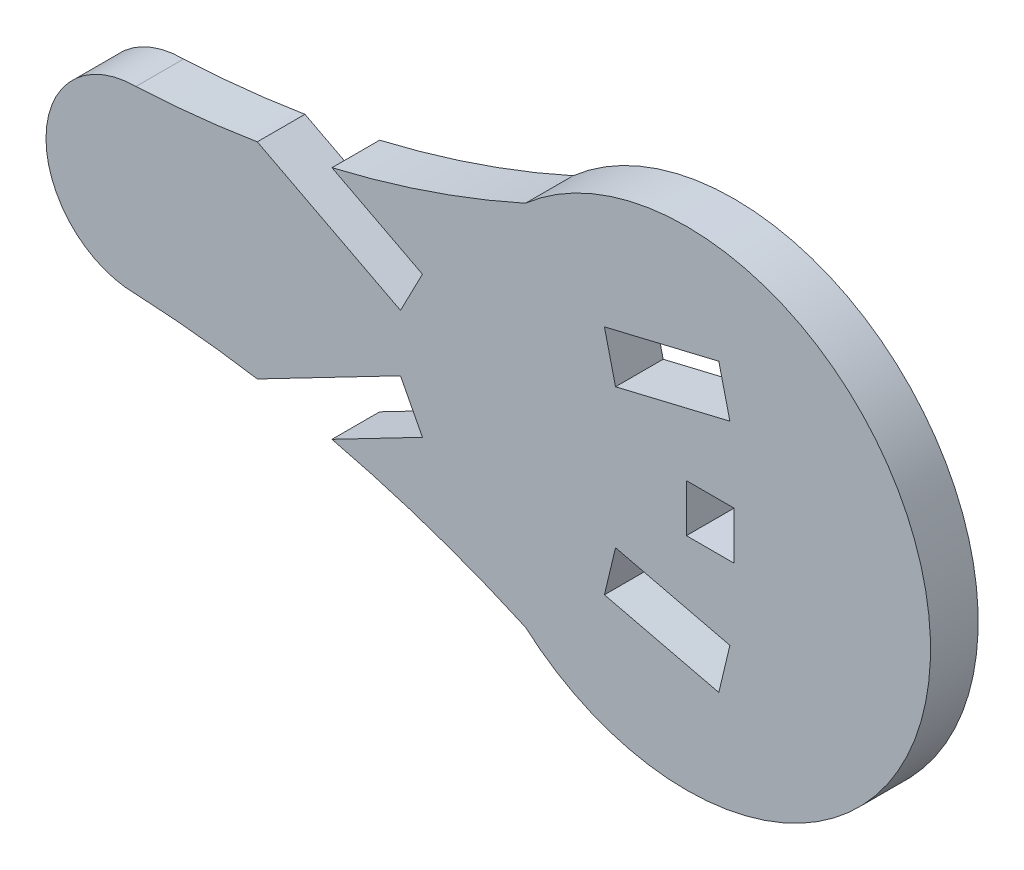
ISO-10303-21;
HEADER;
FILE_DESCRIPTION(('STEP AP214'),'2;1');
FILE_NAME('part.step','',(''),(''),'','','');
FILE_SCHEMA(('AUTOMOTIVE_DESIGN { 1 0 10303 214 1 1 1 1 }'));
ENDSEC;
DATA;
#1=APPLICATION_CONTEXT('core data for automotive mechanical design processes');
#2=APPLICATION_PROTOCOL_DEFINITION('international standard','automotive_design',2000,#1);
#3=PRODUCT_CONTEXT('',#1,'mechanical');
#4=PRODUCT('Part','Part','',(#3));
#5=PRODUCT_RELATED_PRODUCT_CATEGORY('part','',(#4));
#6=PRODUCT_DEFINITION_FORMATION('','',#4);
#7=PRODUCT_DEFINITION_CONTEXT('part definition',#1,'design');
#8=PRODUCT_DEFINITION('design','',#6,#7);
#9=PRODUCT_DEFINITION_SHAPE('','',#8);
#10=(LENGTH_UNIT() NAMED_UNIT(*) SI_UNIT(.MILLI.,.METRE.));
#11=(NAMED_UNIT(*) PLANE_ANGLE_UNIT() SI_UNIT($,.RADIAN.));
#12=(NAMED_UNIT(*) SI_UNIT($,.STERADIAN.) SOLID_ANGLE_UNIT());
#13=UNCERTAINTY_MEASURE_WITH_UNIT(LENGTH_MEASURE(1.E-05),#10,'distance_accuracy_value','');
#14=(GEOMETRIC_REPRESENTATION_CONTEXT(3) GLOBAL_UNCERTAINTY_ASSIGNED_CONTEXT((#13)) GLOBAL_UNIT_ASSIGNED_CONTEXT((#10,
#11,#12)) REPRESENTATION_CONTEXT('',''));
#15=CARTESIAN_POINT('',(0.,0.,0.));
#16=DIRECTION('',(0.,0.,1.));
#17=DIRECTION('',(1.,0.,0.));
#18=AXIS2_PLACEMENT_3D('',#15,#16,#17);
#19=CARTESIAN_POINT('',(-19.2380535907943,-37.8424047856186,-1.524));
#20=DIRECTION('',(0.,0.,1.));
#21=DIRECTION('',(1.,0.,0.));
#22=AXIS2_PLACEMENT_3D('',#19,#20,#21);
#23=CYLINDRICAL_SURFACE('',#22,34.2445785171118);
#24=DIRECTION('',(0.,0.,1.));
#25=VECTOR('',#24,1.);
#26=CARTESIAN_POINT('',(-11.3324745395271,-4.52284629996638,-1.524));
#27=LINE('',#26,#25);
#28=CARTESIAN_POINT('',(-11.3324745395271,-4.52284629996638,-1.524));
#29=VERTEX_POINT('',#28);
#30=CARTESIAN_POINT('',(-11.3324745395271,-4.52284629996638,0.));
#31=VERTEX_POINT('',#30);
#32=EDGE_CURVE('E279',#29,#31,#27,.T.);
#33=ORIENTED_EDGE('',*,*,#32,.F.);
#34=CARTESIAN_POINT('',(-19.2380535907943,-37.8424047856186,-1.524));
#35=DIRECTION('',(0.,0.,-1.));
#36=DIRECTION('',(-1.,0.,0.));
#37=AXIS2_PLACEMENT_3D('',#34,#35,#36);
#38=CIRCLE('',#37,34.2445785171118);
#39=CARTESIAN_POINT('',(-5.14499179069349,-6.63220185591671,-1.524));
#40=VERTEX_POINT('',#39);
#41=EDGE_CURVE('E342',#29,#40,#38,.T.);
#42=ORIENTED_EDGE('',*,*,#41,.T.);
#43=DIRECTION('',(0.,0.,1.));
#44=VECTOR('',#43,1.);
#45=CARTESIAN_POINT('',(-5.14499179069349,-6.63220185591671,-1.524));
#46=LINE('',#45,#44);
#47=CARTESIAN_POINT('',(-5.14499179069349,-6.63220185591671,0.));
#48=VERTEX_POINT('',#47);
#49=EDGE_CURVE('E372',#40,#48,#46,.T.);
#50=ORIENTED_EDGE('',*,*,#49,.T.);
#51=CARTESIAN_POINT('',(-19.2380535907943,-37.8424047856186,0.));
#52=DIRECTION('',(0.,0.,-1.));
#53=DIRECTION('',(-1.,0.,0.));
#54=AXIS2_PLACEMENT_3D('',#51,#52,#53);
#55=CIRCLE('',#54,34.2445785171118);
#56=EDGE_CURVE('E357',#31,#48,#55,.T.);
#57=ORIENTED_EDGE('',*,*,#56,.F.);
#58=EDGE_LOOP('',(#33,#42,#50,#57));
#59=FACE_BOUND('',#58,.T.);
#60=ADVANCED_FACE('F32',(#59),#23,.F.);
#61=CARTESIAN_POINT('',(-19.2380535907943,36.3184047856186,-1.524));
#62=DIRECTION('',(0.,0.,1.));
#63=DIRECTION('',(1.,0.,0.));
#64=AXIS2_PLACEMENT_3D('',#61,#62,#63);
#65=CYLINDRICAL_SURFACE('',#64,34.2445785171118);
#66=DIRECTION('',(0.,0.,1.));
#67=VECTOR('',#66,1.);
#68=CARTESIAN_POINT('',(-13.7196291128845,2.52139087763793,-1.524));
#69=LINE('',#68,#67);
#70=CARTESIAN_POINT('',(-13.7196291128845,2.52139087763792,-1.524));
#71=VERTEX_POINT('',#70);
#72=CARTESIAN_POINT('',(-13.7196291128845,2.52139087763792,0.));
#73=VERTEX_POINT('',#72);
#74=EDGE_CURVE('E304',#71,#73,#69,.T.);
#75=ORIENTED_EDGE('',*,*,#74,.F.);
#76=CARTESIAN_POINT('',(-19.2380535907943,36.3184047856186,-1.524));
#77=DIRECTION('',(0.,0.,-1.));
#78=DIRECTION('',(1.,0.,0.));
#79=AXIS2_PLACEMENT_3D('',#76,#77,#78);
#80=CIRCLE('',#79,34.2445785171118);
#81=CARTESIAN_POINT('',(-17.59996749399,2.11302755112387,-1.524));
#82=VERTEX_POINT('',#81);
#83=EDGE_CURVE('E350',#71,#82,#80,.T.);
#84=ORIENTED_EDGE('',*,*,#83,.T.);
#85=DIRECTION('',(0.,0.,1.));
#86=VECTOR('',#85,1.);
#87=CARTESIAN_POINT('',(-17.59996749399,2.11302755112387,-1.524));
#88=LINE('',#87,#86);
#89=CARTESIAN_POINT('',(-17.59996749399,2.11302755112387,0.));
#90=VERTEX_POINT('',#89);
#91=EDGE_CURVE('E367',#82,#90,#88,.T.);
#92=ORIENTED_EDGE('',*,*,#91,.T.);
#93=CARTESIAN_POINT('',(-19.2380535907943,36.3184047856186,0.));
#94=DIRECTION('',(0.,0.,-1.));
#95=DIRECTION('',(1.,0.,0.));
#96=AXIS2_PLACEMENT_3D('',#93,#94,#95);
#97=CIRCLE('',#96,34.2445785171118);
#98=EDGE_CURVE('E364',#73,#90,#97,.T.);
#99=ORIENTED_EDGE('',*,*,#98,.F.);
#100=EDGE_LOOP('',(#75,#84,#92,#99));
#101=FACE_BOUND('',#100,.T.);
#102=ADVANCED_FACE('F398',(#101),#65,.F.);
#103=CARTESIAN_POINT('',(-17.59996749399,-0.762000000000001,-1.524));
#104=DIRECTION('',(0.,0.,1.));
#105=DIRECTION('',(1.,0.,0.));
#106=AXIS2_PLACEMENT_3D('',#103,#104,#105);
#107=CYLINDRICAL_SURFACE('',#106,2.87502755112387);
#108=CARTESIAN_POINT('',(-17.59996749399,-0.762000000000001,0.));
#109=DIRECTION('',(0.,0.,1.));
#110=DIRECTION('',(1.,0.,0.));
#111=AXIS2_PLACEMENT_3D('',#108,#109,#110);
#112=CIRCLE('',#111,2.87502755112387);
#113=CARTESIAN_POINT('',(-17.59996749399,-3.63702755112387,0.));
#114=VERTEX_POINT('',#113);
#115=EDGE_CURVE('E332',#90,#114,#112,.T.);
#116=ORIENTED_EDGE('',*,*,#115,.F.);
#117=ORIENTED_EDGE('',*,*,#91,.F.);
#118=CARTESIAN_POINT('',(-17.59996749399,-0.762000000000001,-1.524));
#119=DIRECTION('',(0.,0.,1.));
#120=DIRECTION('',(1.,0.,0.));
#121=AXIS2_PLACEMENT_3D('',#118,#119,#120);
#122=CIRCLE('',#121,2.87502755112387);
#123=CARTESIAN_POINT('',(-17.59996749399,-3.63702755112387,-1.524));
#124=VERTEX_POINT('',#123);
#125=EDGE_CURVE('E339',#82,#124,#122,.T.);
#126=ORIENTED_EDGE('',*,*,#125,.T.);
#127=DIRECTION('',(0.,0.,1.));
#128=VECTOR('',#127,1.);
#129=CARTESIAN_POINT('',(-17.59996749399,-3.63702755112387,-1.524));
#130=LINE('',#129,#128);
#131=EDGE_CURVE('E354',#124,#114,#130,.T.);
#132=ORIENTED_EDGE('',*,*,#131,.T.);
#133=EDGE_LOOP('',(#116,#117,#126,#132));
#134=FACE_BOUND('',#133,.T.);
#135=ADVANCED_FACE('F34',(#134),#107,.T.);
#136=DIRECTION('',(0.,0.,1.));
#137=VECTOR('',#136,1.);
#138=CARTESIAN_POINT('',(-11.3324745395271,2.99884629996638,-1.524));
#139=LINE('',#138,#137);
#140=CARTESIAN_POINT('',(-11.3324745395271,2.99884629996638,0.));
#141=VERTEX_POINT('',#140);
#142=CARTESIAN_POINT('',(-11.3324745395271,2.99884629996638,-1.524));
#143=VERTEX_POINT('',#142);
#144=EDGE_CURVE('E299',#141,#143,#139,.F.);
#145=ORIENTED_EDGE('',*,*,#144,.F.);
#146=CARTESIAN_POINT('',(-5.14499179069349,5.10820185591671,0.));
#147=VERTEX_POINT('',#146);
#148=EDGE_CURVE('E343',#147,#141,#97,.T.);
#149=ORIENTED_EDGE('',*,*,#148,.F.);
#150=DIRECTION('',(0.,0.,1.));
#151=VECTOR('',#150,1.);
#152=CARTESIAN_POINT('',(-5.14499179069349,5.10820185591671,-1.524));
#153=LINE('',#152,#151);
#154=CARTESIAN_POINT('',(-5.14499179069349,5.10820185591671,-1.524));
#155=VERTEX_POINT('',#154);
#156=EDGE_CURVE('E370',#155,#147,#153,.T.);
#157=ORIENTED_EDGE('',*,*,#156,.F.);
#158=EDGE_CURVE('E351',#155,#143,#80,.T.);
#159=ORIENTED_EDGE('',*,*,#158,.T.);
#160=EDGE_LOOP('',(#145,#149,#157,#159));
#161=FACE_BOUND('',#160,.T.);
#162=ADVANCED_FACE('F428',(#161),#65,.F.);
#163=CARTESIAN_POINT('',(0.,-0.762000000000001,-1.524));
#164=DIRECTION('',(0.,0.,1.));
#165=DIRECTION('',(1.,0.,0.));
#166=AXIS2_PLACEMENT_3D('',#163,#164,#165);
#167=CYLINDRICAL_SURFACE('',#166,7.80578057310807);
#168=CARTESIAN_POINT('',(0.,-0.762000000000001,0.));
#169=DIRECTION('',(0.,0.,1.));
#170=DIRECTION('',(1.,0.,0.));
#171=AXIS2_PLACEMENT_3D('',#168,#169,#170);
#172=CIRCLE('',#171,7.80578057310807);
#173=EDGE_CURVE('E361',#48,#147,#172,.T.);
#174=ORIENTED_EDGE('',*,*,#173,.F.);
#175=ORIENTED_EDGE('',*,*,#49,.F.);
#176=CARTESIAN_POINT('',(0.,-0.762000000000001,-1.524));
#177=DIRECTION('',(0.,0.,1.));
#178=DIRECTION('',(1.,0.,0.));
#179=AXIS2_PLACEMENT_3D('',#176,#177,#178);
#180=CIRCLE('',#179,7.80578057310807);
#181=EDGE_CURVE('E347',#40,#155,#180,.T.);
#182=ORIENTED_EDGE('',*,*,#181,.T.);
#183=ORIENTED_EDGE('',*,*,#156,.T.);
#184=EDGE_LOOP('',(#174,#175,#182,#183));
#185=FACE_BOUND('',#184,.T.);
#186=ADVANCED_FACE('F424',(#185),#167,.T.);
#187=DIRECTION('',(0.,0.,1.));
#188=VECTOR('',#187,1.);
#189=CARTESIAN_POINT('',(-13.7196291128845,-4.04539087763792,-1.524));
#190=LINE('',#189,#188);
#191=CARTESIAN_POINT('',(-13.7196291128845,-4.04539087763791,0.));
#192=VERTEX_POINT('',#191);
#193=CARTESIAN_POINT('',(-13.7196291128845,-4.04539087763792,-1.524));
#194=VERTEX_POINT('',#193);
#195=EDGE_CURVE('E274',#192,#194,#190,.F.);
#196=ORIENTED_EDGE('',*,*,#195,.F.);
#197=EDGE_CURVE('E358',#114,#192,#55,.T.);
#198=ORIENTED_EDGE('',*,*,#197,.F.);
#199=ORIENTED_EDGE('',*,*,#131,.F.);
#200=EDGE_CURVE('E344',#124,#194,#38,.T.);
#201=ORIENTED_EDGE('',*,*,#200,.T.);
#202=EDGE_LOOP('',(#196,#198,#199,#201));
#203=FACE_BOUND('',#202,.T.);
#204=ADVANCED_FACE('F407',(#203),#23,.F.);
#205=CARTESIAN_POINT('',(-18.4190105423922,-19.3022023928093,-1.524));
#206=DIRECTION('',(0.,0.,1.));
#207=DIRECTION('',(1.,0.,0.));
#208=AXIS2_PLACEMENT_3D('',#205,#206,#207);
#209=PLANE('',#208);
#210=DIRECTION('',(-0.972538002608105,0.232744137376298,0.));
#211=VECTOR('',#210,1.);
#212=CARTESIAN_POINT('',(-13.8517188087433,-0.217447648633504,-1.524));
#213=LINE('',#212,#211);
#214=CARTESIAN_POINT('',(1.39062325581189,-3.86518762989456,-1.524));
#215=VERTEX_POINT('',#214);
#216=CARTESIAN_POINT('',(-2.26611337656362,-2.99007117086453,-1.524));
#217=VERTEX_POINT('',#216);
#218=EDGE_CURVE('E224',#215,#217,#213,.T.);
#219=ORIENTED_EDGE('',*,*,#218,.T.);
#220=DIRECTION('',(-0.232744137376298,-0.972538002608105,0.));
#221=VECTOR('',#220,1.);
#222=CARTESIAN_POINT('',(-6.83340511021252,-22.0748259150403,-1.524));
#223=LINE('',#222,#221);
#224=CARTESIAN_POINT('',(-2.6208154419251,-4.47221908683928,-1.524));
#225=VERTEX_POINT('',#224);
#226=EDGE_CURVE('E227',#217,#225,#223,.T.);
#227=ORIENTED_EDGE('',*,*,#226,.T.);
#228=DIRECTION('',(0.972538002608105,-0.232744137376298,0.));
#229=VECTOR('',#228,1.);
#230=CARTESIAN_POINT('',(-14.2064208741047,-1.69959556460825,-1.524));
#231=LINE('',#230,#229);
#232=CARTESIAN_POINT('',(1.03592119045041,-5.34733554586931,-1.524));
#233=VERTEX_POINT('',#232);
#234=EDGE_CURVE('E219',#225,#233,#231,.T.);
#235=ORIENTED_EDGE('',*,*,#234,.T.);
#236=DIRECTION('',(0.232744137376299,0.972538002608105,0.));
#237=VECTOR('',#236,1.);
#238=CARTESIAN_POINT('',(-3.17666847783702,-22.9499423740704,-1.524));
#239=LINE('',#238,#237);
#240=EDGE_CURVE('E199',#233,#215,#239,.T.);
#241=ORIENTED_EDGE('',*,*,#240,.T.);
#242=EDGE_LOOP('',(#219,#227,#235,#241));
#243=FACE_BOUND('',#242,.T.);
#244=DIRECTION('',(-0.232744137376299,0.972538002608105,0.));
#245=VECTOR('',#244,1.);
#246=CARTESIAN_POINT('',(5.21657453174541,-13.6458230588276,-1.524));
#247=LINE('',#246,#245);
#248=CARTESIAN_POINT('',(1.39062325581189,2.34118762989456,-1.524));
#249=VERTEX_POINT('',#248);
#250=CARTESIAN_POINT('',(1.03592119045041,3.82333554586931,-1.524));
#251=VERTEX_POINT('',#250);
#252=EDGE_CURVE('E256',#249,#251,#247,.T.);
#253=ORIENTED_EDGE('',*,*,#252,.T.);
#254=DIRECTION('',(-0.972538002608105,-0.232744137376298,0.));
#255=VECTOR('',#254,1.);
#256=CARTESIAN_POINT('',(-22.5996638836872,-1.83304378811232,-1.524));
#257=LINE('',#256,#255);
#258=CARTESIAN_POINT('',(-2.6208154419251,2.94821908683928,-1.524));
#259=VERTEX_POINT('',#258);
#260=EDGE_CURVE('E259',#251,#259,#257,.T.);
#261=ORIENTED_EDGE('',*,*,#260,.T.);
#262=DIRECTION('',(0.232744137376298,-0.972538002608105,0.));
#263=VECTOR('',#262,1.);
#264=CARTESIAN_POINT('',(1.5598378993699,-14.5209395178577,-1.524));
#265=LINE('',#264,#263);
#266=CARTESIAN_POINT('',(-2.26611337656362,1.46607117086453,-1.524));
#267=VERTEX_POINT('',#266);
#268=EDGE_CURVE('E244',#259,#267,#265,.T.);
#269=ORIENTED_EDGE('',*,*,#268,.T.);
#270=DIRECTION('',(0.972538002608105,0.232744137376299,0.));
#271=VECTOR('',#270,1.);
#272=CARTESIAN_POINT('',(-22.2449618183257,-3.31519170408708,-1.524));
#273=LINE('',#272,#271);
#274=EDGE_CURVE('E253',#267,#249,#273,.T.);
#275=ORIENTED_EDGE('',*,*,#274,.T.);
#276=EDGE_LOOP('',(#253,#261,#269,#275));
#277=FACE_BOUND('',#276,.T.);
#278=ORIENTED_EDGE('',*,*,#41,.F.);
#279=DIRECTION('',(0.887441965331205,0.460919470373176,0.));
#280=VECTOR('',#279,1.);
#281=CARTESIAN_POINT('',(-22.958836126583,-10.5613441786112,-1.524));
#282=LINE('',#281,#280);
#283=CARTESIAN_POINT('',(-8.4388056183389,-3.01993298428651,-1.524));
#284=VERTEX_POINT('',#283);
#285=EDGE_CURVE('E276',#29,#284,#282,.T.);
#286=ORIENTED_EDGE('',*,*,#285,.T.);
#287=DIRECTION('',(-0.460919470373176,0.887441965331205,0.));
#288=VECTOR('',#287,1.);
#289=CARTESIAN_POINT('',(-3.89898003414804,-11.7607911984846,-1.524));
#290=LINE('',#289,#288);
#291=CARTESIAN_POINT('',(-9.14124689118762,-1.66747142912175,-1.524));
#292=VERTEX_POINT('',#291);
#293=EDGE_CURVE('E281',#284,#292,#290,.T.);
#294=ORIENTED_EDGE('',*,*,#293,.T.);
#295=DIRECTION('',(-0.887441965331205,-0.460919470373176,0.));
#296=VECTOR('',#295,1.);
#297=CARTESIAN_POINT('',(-23.6612773994317,-9.20888262344643,-1.524));
#298=LINE('',#297,#296);
#299=EDGE_CURVE('E269',#292,#194,#298,.T.);
#300=ORIENTED_EDGE('',*,*,#299,.T.);
#301=ORIENTED_EDGE('',*,*,#200,.F.);
#302=ORIENTED_EDGE('',*,*,#125,.F.);
#303=ORIENTED_EDGE('',*,*,#83,.F.);
#304=DIRECTION('',(0.887441965331205,-0.460919470373176,0.));
#305=VECTOR('',#304,1.);
#306=CARTESIAN_POINT('',(-8.49393529980831,-0.192729164855816,-1.524));
#307=LINE('',#306,#305);
#308=CARTESIAN_POINT('',(-9.14124689118762,0.14347142912175,-1.524));
#309=VERTEX_POINT('',#308);
#310=EDGE_CURVE('E301',#71,#309,#307,.T.);
#311=ORIENTED_EDGE('',*,*,#310,.T.);
#312=DIRECTION('',(0.460919470373176,0.887441965331205,0.));
#313=VECTOR('',#312,1.);
#314=CARTESIAN_POINT('',(-19.0663221337715,-18.9660017988317,-1.524));
#315=LINE('',#314,#313);
#316=CARTESIAN_POINT('',(-8.4388056183389,1.49593298428651,-1.524));
#317=VERTEX_POINT('',#316);
#318=EDGE_CURVE('E292',#309,#317,#315,.T.);
#319=ORIENTED_EDGE('',*,*,#318,.T.);
#320=DIRECTION('',(-0.887441965331205,0.460919470373176,0.));
#321=VECTOR('',#320,1.);
#322=CARTESIAN_POINT('',(-7.79149402695959,1.15973239030894,-1.524));
#323=LINE('',#322,#321);
#324=EDGE_CURVE('E296',#317,#143,#323,.T.);
#325=ORIENTED_EDGE('',*,*,#324,.T.);
#326=ORIENTED_EDGE('',*,*,#158,.F.);
#327=ORIENTED_EDGE('',*,*,#181,.F.);
#328=EDGE_LOOP('',(#278,#286,#294,#300,#301,#302,#303,#311,#319,#325,#326,#327));
#329=FACE_BOUND('',#328,.T.);
#330=DIRECTION('',(1.,0.,0.));
#331=VECTOR('',#330,1.);
#332=CARTESIAN_POINT('',(1.524,-1.524,-1.524));
#333=LINE('',#332,#331);
#334=CARTESIAN_POINT('',(0.,-1.524,-1.524));
#335=VERTEX_POINT('',#334);
#336=CARTESIAN_POINT('',(1.524,-1.524,-1.524));
#337=VERTEX_POINT('',#336);
#338=EDGE_CURVE('E317',#335,#337,#333,.T.);
#339=ORIENTED_EDGE('',*,*,#338,.T.);
#340=DIRECTION('',(0.,1.,0.));
#341=VECTOR('',#340,1.);
#342=CARTESIAN_POINT('',(1.524,0.,-1.524));
#343=LINE('',#342,#341);
#344=CARTESIAN_POINT('',(1.524,0.,-1.524));
#345=VERTEX_POINT('',#344);
#346=EDGE_CURVE('E307',#337,#345,#343,.T.);
#347=ORIENTED_EDGE('',*,*,#346,.T.);
#348=DIRECTION('',(-1.,0.,0.));
#349=VECTOR('',#348,1.);
#350=CARTESIAN_POINT('',(1.524,0.,-1.524));
#351=LINE('',#350,#349);
#352=CARTESIAN_POINT('',(0.,0.,-1.524));
#353=VERTEX_POINT('',#352);
#354=EDGE_CURVE('E310',#345,#353,#351,.T.);
#355=ORIENTED_EDGE('',*,*,#354,.T.);
#356=DIRECTION('',(0.,-1.,0.));
#357=VECTOR('',#356,1.);
#358=CARTESIAN_POINT('',(0.,0.,-1.524));
#359=LINE('',#358,#357);
#360=EDGE_CURVE('E314',#353,#335,#359,.T.);
#361=ORIENTED_EDGE('',*,*,#360,.T.);
#362=EDGE_LOOP('',(#339,#347,#355,#361));
#363=FACE_BOUND('',#362,.T.);
#364=ADVANCED_FACE('F392',(#243,#277,#329,#363),#209,.F.);
#365=CARTESIAN_POINT('',(-18.4190105423922,-19.3022023928093,0.));
#366=DIRECTION('',(0.,0.,1.));
#367=DIRECTION('',(1.,0.,0.));
#368=AXIS2_PLACEMENT_3D('',#365,#366,#367);
#369=PLANE('',#368);
#370=DIRECTION('',(-0.232744137376298,-0.972538002608105,0.));
#371=VECTOR('',#370,1.);
#372=CARTESIAN_POINT('',(-2.6208154419251,-4.47221908683928,0.));
#373=LINE('',#372,#371);
#374=CARTESIAN_POINT('',(-2.26611337656362,-2.99007117086453,0.));
#375=VERTEX_POINT('',#374);
#376=CARTESIAN_POINT('',(-2.62081544192509,-4.47221908683928,0.));
#377=VERTEX_POINT('',#376);
#378=EDGE_CURVE('E55',#375,#377,#373,.T.);
#379=ORIENTED_EDGE('',*,*,#378,.F.);
#380=DIRECTION('',(-0.972538002608105,0.232744137376298,0.));
#381=VECTOR('',#380,1.);
#382=CARTESIAN_POINT('',(-2.26611337656362,-2.99007117086453,0.));
#383=LINE('',#382,#381);
#384=CARTESIAN_POINT('',(1.39062325581189,-3.86518762989456,0.));
#385=VERTEX_POINT('',#384);
#386=EDGE_CURVE('E212',#385,#375,#383,.T.);
#387=ORIENTED_EDGE('',*,*,#386,.F.);
#388=DIRECTION('',(0.232744137376299,0.972538002608105,0.));
#389=VECTOR('',#388,1.);
#390=CARTESIAN_POINT('',(1.03592119045041,-5.34733554586931,0.));
#391=LINE('',#390,#389);
#392=CARTESIAN_POINT('',(1.03592119045041,-5.34733554586931,0.));
#393=VERTEX_POINT('',#392);
#394=EDGE_CURVE('E196',#393,#385,#391,.T.);
#395=ORIENTED_EDGE('',*,*,#394,.F.);
#396=DIRECTION('',(0.972538002608105,-0.232744137376298,0.));
#397=VECTOR('',#396,1.);
#398=CARTESIAN_POINT('',(-2.6208154419251,-4.47221908683928,0.));
#399=LINE('',#398,#397);
#400=EDGE_CURVE('E205',#377,#393,#399,.T.);
#401=ORIENTED_EDGE('',*,*,#400,.F.);
#402=EDGE_LOOP('',(#379,#387,#395,#401));
#403=FACE_BOUND('',#402,.T.);
#404=DIRECTION('',(-0.972538002608105,-0.232744137376298,0.));
#405=VECTOR('',#404,1.);
#406=CARTESIAN_POINT('',(-2.6208154419251,2.94821908683928,0.));
#407=LINE('',#406,#405);
#408=CARTESIAN_POINT('',(1.03592119045041,3.82333554586931,0.));
#409=VERTEX_POINT('',#408);
#410=CARTESIAN_POINT('',(-2.6208154419251,2.94821908683928,0.));
#411=VERTEX_POINT('',#410);
#412=EDGE_CURVE('E230',#409,#411,#407,.T.);
#413=ORIENTED_EDGE('',*,*,#412,.F.);
#414=DIRECTION('',(-0.232744137376299,0.972538002608105,0.));
#415=VECTOR('',#414,1.);
#416=CARTESIAN_POINT('',(1.03592119045041,3.82333554586931,0.));
#417=LINE('',#416,#415);
#418=CARTESIAN_POINT('',(1.39062325581189,2.34118762989456,0.));
#419=VERTEX_POINT('',#418);
#420=EDGE_CURVE('E238',#419,#409,#417,.T.);
#421=ORIENTED_EDGE('',*,*,#420,.F.);
#422=DIRECTION('',(0.972538002608105,0.232744137376299,0.));
#423=VECTOR('',#422,1.);
#424=CARTESIAN_POINT('',(-2.26611337656362,1.46607117086452,0.));
#425=LINE('',#424,#423);
#426=CARTESIAN_POINT('',(-2.26611337656362,1.46607117086452,0.));
#427=VERTEX_POINT('',#426);
#428=EDGE_CURVE('E235',#427,#419,#425,.T.);
#429=ORIENTED_EDGE('',*,*,#428,.F.);
#430=DIRECTION('',(0.232744137376298,-0.972538002608105,0.));
#431=VECTOR('',#430,1.);
#432=CARTESIAN_POINT('',(-2.6208154419251,2.94821908683928,0.));
#433=LINE('',#432,#431);
#434=EDGE_CURVE('E232',#411,#427,#433,.T.);
#435=ORIENTED_EDGE('',*,*,#434,.F.);
#436=EDGE_LOOP('',(#413,#421,#429,#435));
#437=FACE_BOUND('',#436,.T.);
#438=DIRECTION('',(0.887441965331205,0.460919470373176,0.));
#439=VECTOR('',#438,1.);
#440=CARTESIAN_POINT('',(-22.958836126583,-10.5613441786112,0.));
#441=LINE('',#440,#439);
#442=CARTESIAN_POINT('',(-8.4388056183389,-3.01993298428651,0.));
#443=VERTEX_POINT('',#442);
#444=EDGE_CURVE('E11',#31,#443,#441,.T.);
#445=ORIENTED_EDGE('',*,*,#444,.F.);
#446=ORIENTED_EDGE('',*,*,#56,.T.);
#447=ORIENTED_EDGE('',*,*,#173,.T.);
#448=ORIENTED_EDGE('',*,*,#148,.T.);
#449=DIRECTION('',(-0.887441965331205,0.460919470373176,0.));
#450=VECTOR('',#449,1.);
#451=CARTESIAN_POINT('',(-8.4388056183389,1.49593298428651,0.));
#452=LINE('',#451,#450);
#453=CARTESIAN_POINT('',(-8.4388056183389,1.49593298428651,0.));
#454=VERTEX_POINT('',#453);
#455=EDGE_CURVE('E287',#454,#141,#452,.T.);
#456=ORIENTED_EDGE('',*,*,#455,.F.);
#457=DIRECTION('',(0.460919470373176,0.887441965331204,0.));
#458=VECTOR('',#457,1.);
#459=CARTESIAN_POINT('',(-9.14124689118762,0.14347142912175,0.));
#460=LINE('',#459,#458);
#461=CARTESIAN_POINT('',(-9.14124689118762,0.143471429121751,0.));
#462=VERTEX_POINT('',#461);
#463=EDGE_CURVE('E284',#462,#454,#460,.T.);
#464=ORIENTED_EDGE('',*,*,#463,.F.);
#465=DIRECTION('',(0.887441965331205,-0.460919470373176,0.));
#466=VECTOR('',#465,1.);
#467=CARTESIAN_POINT('',(-8.49393529980831,-0.192729164855816,0.));
#468=LINE('',#467,#466);
#469=EDGE_CURVE('E40',#73,#462,#468,.T.);
#470=ORIENTED_EDGE('',*,*,#469,.F.);
#471=ORIENTED_EDGE('',*,*,#98,.T.);
#472=ORIENTED_EDGE('',*,*,#115,.T.);
#473=ORIENTED_EDGE('',*,*,#197,.T.);
#474=DIRECTION('',(-0.887441965331205,-0.460919470373176,0.));
#475=VECTOR('',#474,1.);
#476=CARTESIAN_POINT('',(-9.14124689118762,-1.66747142912175,0.));
#477=LINE('',#476,#475);
#478=CARTESIAN_POINT('',(-9.14124689118762,-1.66747142912176,0.));
#479=VERTEX_POINT('',#478);
#480=EDGE_CURVE('E264',#479,#192,#477,.T.);
#481=ORIENTED_EDGE('',*,*,#480,.F.);
#482=DIRECTION('',(-0.460919470373176,0.887441965331204,0.));
#483=VECTOR('',#482,1.);
#484=CARTESIAN_POINT('',(-9.14124689118762,-1.66747142912175,0.));
#485=LINE('',#484,#483);
#486=EDGE_CURVE('E262',#443,#479,#485,.T.);
#487=ORIENTED_EDGE('',*,*,#486,.F.);
#488=EDGE_LOOP('',(#445,#446,#447,#448,#456,#464,#470,#471,#472,#473,#481,#487));
#489=FACE_BOUND('',#488,.T.);
#490=DIRECTION('',(0.,1.,0.));
#491=VECTOR('',#490,1.);
#492=CARTESIAN_POINT('',(1.524,0.,0.));
#493=LINE('',#492,#491);
#494=CARTESIAN_POINT('',(1.524,-1.524,0.));
#495=VERTEX_POINT('',#494);
#496=CARTESIAN_POINT('',(1.52399999999999,0.,0.));
#497=VERTEX_POINT('',#496);
#498=EDGE_CURVE('E306',#495,#497,#493,.T.);
#499=ORIENTED_EDGE('',*,*,#498,.F.);
#500=DIRECTION('',(1.,0.,0.));
#501=VECTOR('',#500,1.);
#502=CARTESIAN_POINT('',(1.524,-1.524,0.));
#503=LINE('',#502,#501);
#504=CARTESIAN_POINT('',(0.,-1.524,0.));
#505=VERTEX_POINT('',#504);
#506=EDGE_CURVE('E311',#505,#495,#503,.T.);
#507=ORIENTED_EDGE('',*,*,#506,.F.);
#508=DIRECTION('',(0.,-1.,0.));
#509=VECTOR('',#508,1.);
#510=CARTESIAN_POINT('',(0.,0.,0.));
#511=LINE('',#510,#509);
#512=CARTESIAN_POINT('',(0.,0.,0.));
#513=VERTEX_POINT('',#512);
#514=EDGE_CURVE('E325',#513,#505,#511,.T.);
#515=ORIENTED_EDGE('',*,*,#514,.F.);
#516=DIRECTION('',(-1.,0.,0.));
#517=VECTOR('',#516,1.);
#518=CARTESIAN_POINT('',(1.524,0.,0.));
#519=LINE('',#518,#517);
#520=EDGE_CURVE('E322',#497,#513,#519,.T.);
#521=ORIENTED_EDGE('',*,*,#520,.F.);
#522=EDGE_LOOP('',(#499,#507,#515,#521));
#523=FACE_BOUND('',#522,.T.);
#524=ADVANCED_FACE('F209',(#403,#437,#489,#523),#369,.T.);
#525=CARTESIAN_POINT('',(1.524,0.,-1.524));
#526=DIRECTION('',(1.,0.,0.));
#527=DIRECTION('',(0.,0.,-1.));
#528=AXIS2_PLACEMENT_3D('',#525,#526,#527);
#529=PLANE('',#528);
#530=ORIENTED_EDGE('',*,*,#498,.T.);
#531=DIRECTION('',(0.,0.,1.));
#532=VECTOR('',#531,1.);
#533=CARTESIAN_POINT('',(1.524,0.,-1.524));
#534=LINE('',#533,#532);
#535=EDGE_CURVE('E320',#345,#497,#534,.T.);
#536=ORIENTED_EDGE('',*,*,#535,.F.);
#537=ORIENTED_EDGE('',*,*,#346,.F.);
#538=DIRECTION('',(0.,0.,1.));
#539=VECTOR('',#538,1.);
#540=CARTESIAN_POINT('',(1.524,-1.524,-1.524));
#541=LINE('',#540,#539);
#542=EDGE_CURVE('E330',#337,#495,#541,.T.);
#543=ORIENTED_EDGE('',*,*,#542,.T.);
#544=EDGE_LOOP('',(#530,#536,#537,#543));
#545=FACE_BOUND('',#544,.T.);
#546=ADVANCED_FACE('F458',(#545),#529,.F.);
#547=CARTESIAN_POINT('',(1.524,-1.524,-1.524));
#548=DIRECTION('',(0.,-1.,0.));
#549=DIRECTION('',(0.,0.,-1.));
#550=AXIS2_PLACEMENT_3D('',#547,#548,#549);
#551=PLANE('',#550);
#552=ORIENTED_EDGE('',*,*,#506,.T.);
#553=ORIENTED_EDGE('',*,*,#542,.F.);
#554=ORIENTED_EDGE('',*,*,#338,.F.);
#555=DIRECTION('',(0.,0.,1.));
#556=VECTOR('',#555,1.);
#557=CARTESIAN_POINT('',(0.,-1.524,-1.524));
#558=LINE('',#557,#556);
#559=EDGE_CURVE('E333',#335,#505,#558,.T.);
#560=ORIENTED_EDGE('',*,*,#559,.T.);
#561=EDGE_LOOP('',(#552,#553,#554,#560));
#562=FACE_BOUND('',#561,.T.);
#563=ADVANCED_FACE('F462',(#562),#551,.F.);
#564=CARTESIAN_POINT('',(0.,0.,-1.524));
#565=DIRECTION('',(-1.,0.,0.));
#566=DIRECTION('',(0.,0.,1.));
#567=AXIS2_PLACEMENT_3D('',#564,#565,#566);
#568=PLANE('',#567);
#569=ORIENTED_EDGE('',*,*,#514,.T.);
#570=ORIENTED_EDGE('',*,*,#559,.F.);
#571=ORIENTED_EDGE('',*,*,#360,.F.);
#572=DIRECTION('',(0.,0.,1.));
#573=VECTOR('',#572,1.);
#574=CARTESIAN_POINT('',(0.,0.,-1.524));
#575=LINE('',#574,#573);
#576=EDGE_CURVE('E335',#353,#513,#575,.T.);
#577=ORIENTED_EDGE('',*,*,#576,.T.);
#578=EDGE_LOOP('',(#569,#570,#571,#577));
#579=FACE_BOUND('',#578,.T.);
#580=ADVANCED_FACE('F467',(#579),#568,.F.);
#581=CARTESIAN_POINT('',(1.524,0.,-1.524));
#582=DIRECTION('',(0.,1.,0.));
#583=DIRECTION('',(0.,0.,1.));
#584=AXIS2_PLACEMENT_3D('',#581,#582,#583);
#585=PLANE('',#584);
#586=ORIENTED_EDGE('',*,*,#520,.T.);
#587=ORIENTED_EDGE('',*,*,#576,.F.);
#588=ORIENTED_EDGE('',*,*,#354,.F.);
#589=ORIENTED_EDGE('',*,*,#535,.T.);
#590=EDGE_LOOP('',(#586,#587,#588,#589));
#591=FACE_BOUND('',#590,.T.);
#592=ADVANCED_FACE('F464',(#591),#585,.F.);
#593=CARTESIAN_POINT('',(-9.14124689118762,0.14347142912175,-2.54));
#594=DIRECTION('',(0.887441965331204,-0.460919470373176,0.));
#595=DIRECTION('',(0.460919470373176,0.887441965331205,0.));
#596=AXIS2_PLACEMENT_3D('',#593,#594,#595);
#597=PLANE('',#596);
#598=DIRECTION('',(0.,0.,1.));
#599=VECTOR('',#598,1.);
#600=CARTESIAN_POINT('',(-9.14124689118762,0.14347142912175,-2.54));
#601=LINE('',#600,#599);
#602=EDGE_CURVE('E289',#309,#462,#601,.T.);
#603=ORIENTED_EDGE('',*,*,#602,.T.);
#604=ORIENTED_EDGE('',*,*,#463,.T.);
#605=DIRECTION('',(0.,0.,1.));
#606=VECTOR('',#605,1.);
#607=CARTESIAN_POINT('',(-8.4388056183389,1.49593298428651,-2.54));
#608=LINE('',#607,#606);
#609=EDGE_CURVE('E290',#317,#454,#608,.T.);
#610=ORIENTED_EDGE('',*,*,#609,.F.);
#611=ORIENTED_EDGE('',*,*,#318,.F.);
#612=EDGE_LOOP('',(#603,#604,#610,#611));
#613=FACE_BOUND('',#612,.T.);
#614=ADVANCED_FACE('F389',(#613),#597,.F.);
#615=CARTESIAN_POINT('',(-9.14124689118762,0.14347142912175,-2.54));
#616=DIRECTION('',(-0.460919470373176,-0.887441965331205,0.));
#617=DIRECTION('',(0.887441965331205,-0.460919470373176,0.));
#618=AXIS2_PLACEMENT_3D('',#615,#616,#617);
#619=PLANE('',#618);
#620=ORIENTED_EDGE('',*,*,#74,.T.);
#621=ORIENTED_EDGE('',*,*,#469,.T.);
#622=ORIENTED_EDGE('',*,*,#602,.F.);
#623=ORIENTED_EDGE('',*,*,#310,.F.);
#624=EDGE_LOOP('',(#620,#621,#622,#623));
#625=FACE_BOUND('',#624,.T.);
#626=ADVANCED_FACE('F380',(#625),#619,.F.);
#627=CARTESIAN_POINT('',(-8.4388056183389,1.49593298428651,-2.54));
#628=DIRECTION('',(0.460919470373176,0.887441965331205,0.));
#629=DIRECTION('',(-0.887441965331205,0.460919470373176,0.));
#630=AXIS2_PLACEMENT_3D('',#627,#628,#629);
#631=PLANE('',#630);
#632=ORIENTED_EDGE('',*,*,#144,.T.);
#633=ORIENTED_EDGE('',*,*,#324,.F.);
#634=ORIENTED_EDGE('',*,*,#609,.T.);
#635=ORIENTED_EDGE('',*,*,#455,.T.);
#636=EDGE_LOOP('',(#632,#633,#634,#635));
#637=FACE_BOUND('',#636,.T.);
#638=ADVANCED_FACE('F430',(#637),#631,.F.);
#639=CARTESIAN_POINT('',(-9.14124689118762,-1.66747142912175,-2.54));
#640=DIRECTION('',(0.887441965331204,0.460919470373176,0.));
#641=DIRECTION('',(-0.460919470373176,0.887441965331205,0.));
#642=AXIS2_PLACEMENT_3D('',#639,#640,#641);
#643=PLANE('',#642);
#644=DIRECTION('',(0.,0.,1.));
#645=VECTOR('',#644,1.);
#646=CARTESIAN_POINT('',(-8.4388056183389,-3.01993298428651,-2.54));
#647=LINE('',#646,#645);
#648=EDGE_CURVE('E267',#284,#443,#647,.T.);
#649=ORIENTED_EDGE('',*,*,#648,.T.);
#650=ORIENTED_EDGE('',*,*,#486,.T.);
#651=DIRECTION('',(0.,0.,1.));
#652=VECTOR('',#651,1.);
#653=CARTESIAN_POINT('',(-9.14124689118762,-1.66747142912175,-2.54));
#654=LINE('',#653,#652);
#655=EDGE_CURVE('E266',#292,#479,#654,.T.);
#656=ORIENTED_EDGE('',*,*,#655,.F.);
#657=ORIENTED_EDGE('',*,*,#293,.F.);
#658=EDGE_LOOP('',(#649,#650,#656,#657));
#659=FACE_BOUND('',#658,.T.);
#660=ADVANCED_FACE('F413',(#659),#643,.F.);
#661=CARTESIAN_POINT('',(-8.4388056183389,-3.01993298428651,-2.54));
#662=DIRECTION('',(0.460919470373176,-0.887441965331205,0.));
#663=DIRECTION('',(0.887441965331205,0.460919470373176,0.));
#664=AXIS2_PLACEMENT_3D('',#661,#662,#663);
#665=PLANE('',#664);
#666=ORIENTED_EDGE('',*,*,#32,.T.);
#667=ORIENTED_EDGE('',*,*,#444,.T.);
#668=ORIENTED_EDGE('',*,*,#648,.F.);
#669=ORIENTED_EDGE('',*,*,#285,.F.);
#670=EDGE_LOOP('',(#666,#667,#668,#669));
#671=FACE_BOUND('',#670,.T.);
#672=ADVANCED_FACE('F415',(#671),#665,.F.);
#673=CARTESIAN_POINT('',(-9.14124689118762,-1.66747142912175,-2.54));
#674=DIRECTION('',(-0.460919470373176,0.887441965331205,0.));
#675=DIRECTION('',(-0.887441965331205,-0.460919470373176,0.));
#676=AXIS2_PLACEMENT_3D('',#673,#674,#675);
#677=PLANE('',#676);
#678=ORIENTED_EDGE('',*,*,#195,.T.);
#679=ORIENTED_EDGE('',*,*,#299,.F.);
#680=ORIENTED_EDGE('',*,*,#655,.T.);
#681=ORIENTED_EDGE('',*,*,#480,.T.);
#682=EDGE_LOOP('',(#678,#679,#680,#681));
#683=FACE_BOUND('',#682,.T.);
#684=ADVANCED_FACE('F409',(#683),#677,.F.);
#685=CARTESIAN_POINT('',(-2.6208154419251,2.94821908683928,-2.54));
#686=DIRECTION('',(-0.232744137376298,0.972538002608105,0.));
#687=DIRECTION('',(-0.972538002608105,-0.232744137376298,0.));
#688=AXIS2_PLACEMENT_3D('',#685,#686,#687);
#689=PLANE('',#688);
#690=DIRECTION('',(0.,0.,1.));
#691=VECTOR('',#690,1.);
#692=CARTESIAN_POINT('',(1.03592119045041,3.82333554586931,-2.54));
#693=LINE('',#692,#691);
#694=EDGE_CURVE('E242',#251,#409,#693,.T.);
#695=ORIENTED_EDGE('',*,*,#694,.T.);
#696=ORIENTED_EDGE('',*,*,#412,.T.);
#697=DIRECTION('',(0.,0.,1.));
#698=VECTOR('',#697,1.);
#699=CARTESIAN_POINT('',(-2.6208154419251,2.94821908683928,-2.54));
#700=LINE('',#699,#698);
#701=EDGE_CURVE('E241',#259,#411,#700,.T.);
#702=ORIENTED_EDGE('',*,*,#701,.F.);
#703=ORIENTED_EDGE('',*,*,#260,.F.);
#704=EDGE_LOOP('',(#695,#696,#702,#703));
#705=FACE_BOUND('',#704,.T.);
#706=ADVANCED_FACE('F510',(#705),#689,.F.);
#707=CARTESIAN_POINT('',(1.03592119045041,3.82333554586931,-2.54));
#708=DIRECTION('',(0.972538002608105,0.232744137376299,0.));
#709=DIRECTION('',(-0.232744137376299,0.972538002608105,0.));
#710=AXIS2_PLACEMENT_3D('',#707,#708,#709);
#711=PLANE('',#710);
#712=DIRECTION('',(0.,0.,1.));
#713=VECTOR('',#712,1.);
#714=CARTESIAN_POINT('',(1.39062325581189,2.34118762989456,-2.54));
#715=LINE('',#714,#713);
#716=EDGE_CURVE('E245',#249,#419,#715,.T.);
#717=ORIENTED_EDGE('',*,*,#716,.T.);
#718=ORIENTED_EDGE('',*,*,#420,.T.);
#719=ORIENTED_EDGE('',*,*,#694,.F.);
#720=ORIENTED_EDGE('',*,*,#252,.F.);
#721=EDGE_LOOP('',(#717,#718,#719,#720));
#722=FACE_BOUND('',#721,.T.);
#723=ADVANCED_FACE('F533',(#722),#711,.F.);
#724=CARTESIAN_POINT('',(-2.26611337656362,1.46607117086452,-2.54));
#725=DIRECTION('',(0.232744137376299,-0.972538002608105,0.));
#726=DIRECTION('',(0.972538002608105,0.232744137376299,0.));
#727=AXIS2_PLACEMENT_3D('',#724,#725,#726);
#728=PLANE('',#727);
#729=DIRECTION('',(0.,0.,1.));
#730=VECTOR('',#729,1.);
#731=CARTESIAN_POINT('',(-2.26611337656362,1.46607117086452,-2.54));
#732=LINE('',#731,#730);
#733=EDGE_CURVE('E247',#267,#427,#732,.T.);
#734=ORIENTED_EDGE('',*,*,#733,.T.);
#735=ORIENTED_EDGE('',*,*,#428,.T.);
#736=ORIENTED_EDGE('',*,*,#716,.F.);
#737=ORIENTED_EDGE('',*,*,#274,.F.);
#738=EDGE_LOOP('',(#734,#735,#736,#737));
#739=FACE_BOUND('',#738,.T.);
#740=ADVANCED_FACE('F543',(#739),#728,.F.);
#741=CARTESIAN_POINT('',(-2.6208154419251,2.94821908683928,-2.54));
#742=DIRECTION('',(-0.972538002608105,-0.232744137376298,0.));
#743=DIRECTION('',(0.232744137376298,-0.972538002608105,0.));
#744=AXIS2_PLACEMENT_3D('',#741,#742,#743);
#745=PLANE('',#744);
#746=ORIENTED_EDGE('',*,*,#701,.T.);
#747=ORIENTED_EDGE('',*,*,#434,.T.);
#748=ORIENTED_EDGE('',*,*,#733,.F.);
#749=ORIENTED_EDGE('',*,*,#268,.F.);
#750=EDGE_LOOP('',(#746,#747,#748,#749));
#751=FACE_BOUND('',#750,.T.);
#752=ADVANCED_FACE('F553',(#751),#745,.F.);
#753=CARTESIAN_POINT('',(-2.6208154419251,-4.47221908683928,-2.54));
#754=DIRECTION('',(-0.972538002608105,0.232744137376298,0.));
#755=DIRECTION('',(-0.232744137376298,-0.972538002608105,0.));
#756=AXIS2_PLACEMENT_3D('',#753,#754,#755);
#757=PLANE('',#756);
#758=DIRECTION('',(0.,0.,1.));
#759=VECTOR('',#758,1.);
#760=CARTESIAN_POINT('',(-2.26611337656362,-2.99007117086453,-2.54));
#761=LINE('',#760,#759);
#762=EDGE_CURVE('E217',#217,#375,#761,.T.);
#763=ORIENTED_EDGE('',*,*,#762,.T.);
#764=ORIENTED_EDGE('',*,*,#378,.T.);
#765=DIRECTION('',(0.,0.,1.));
#766=VECTOR('',#765,1.);
#767=CARTESIAN_POINT('',(-2.6208154419251,-4.47221908683928,-2.54));
#768=LINE('',#767,#766);
#769=EDGE_CURVE('E202',#225,#377,#768,.T.);
#770=ORIENTED_EDGE('',*,*,#769,.F.);
#771=ORIENTED_EDGE('',*,*,#226,.F.);
#772=EDGE_LOOP('',(#763,#764,#770,#771));
#773=FACE_BOUND('',#772,.T.);
#774=ADVANCED_FACE('F563',(#773),#757,.F.);
#775=CARTESIAN_POINT('',(-2.26611337656362,-2.99007117086453,-2.54));
#776=DIRECTION('',(0.232744137376298,0.972538002608105,0.));
#777=DIRECTION('',(-0.972538002608105,0.232744137376298,0.));
#778=AXIS2_PLACEMENT_3D('',#775,#776,#777);
#779=PLANE('',#778);
#780=DIRECTION('',(0.,0.,1.));
#781=VECTOR('',#780,1.);
#782=CARTESIAN_POINT('',(1.39062325581189,-3.86518762989456,-2.54));
#783=LINE('',#782,#781);
#784=EDGE_CURVE('E201',#215,#385,#783,.T.);
#785=ORIENTED_EDGE('',*,*,#784,.T.);
#786=ORIENTED_EDGE('',*,*,#386,.T.);
#787=ORIENTED_EDGE('',*,*,#762,.F.);
#788=ORIENTED_EDGE('',*,*,#218,.F.);
#789=EDGE_LOOP('',(#785,#786,#787,#788));
#790=FACE_BOUND('',#789,.T.);
#791=ADVANCED_FACE('F573',(#790),#779,.F.);
#792=CARTESIAN_POINT('',(1.03592119045041,-5.34733554586931,-2.54));
#793=DIRECTION('',(0.972538002608105,-0.232744137376299,0.));
#794=DIRECTION('',(0.232744137376299,0.972538002608105,0.));
#795=AXIS2_PLACEMENT_3D('',#792,#793,#794);
#796=PLANE('',#795);
#797=DIRECTION('',(0.,0.,1.));
#798=VECTOR('',#797,1.);
#799=CARTESIAN_POINT('',(1.03592119045041,-5.34733554586931,-2.54));
#800=LINE('',#799,#798);
#801=EDGE_CURVE('E47',#233,#393,#800,.T.);
#802=ORIENTED_EDGE('',*,*,#801,.T.);
#803=ORIENTED_EDGE('',*,*,#394,.T.);
#804=ORIENTED_EDGE('',*,*,#784,.F.);
#805=ORIENTED_EDGE('',*,*,#240,.F.);
#806=EDGE_LOOP('',(#802,#803,#804,#805));
#807=FACE_BOUND('',#806,.T.);
#808=ADVANCED_FACE('F193',(#807),#796,.F.);
#809=CARTESIAN_POINT('',(-2.6208154419251,-4.47221908683928,-2.54));
#810=DIRECTION('',(-0.232744137376298,-0.972538002608105,0.));
#811=DIRECTION('',(0.972538002608105,-0.232744137376298,0.));
#812=AXIS2_PLACEMENT_3D('',#809,#810,#811);
#813=PLANE('',#812);
#814=ORIENTED_EDGE('',*,*,#769,.T.);
#815=ORIENTED_EDGE('',*,*,#400,.T.);
#816=ORIENTED_EDGE('',*,*,#801,.F.);
#817=ORIENTED_EDGE('',*,*,#234,.F.);
#818=EDGE_LOOP('',(#814,#815,#816,#817));
#819=FACE_BOUND('',#818,.T.);
#820=ADVANCED_FACE('F206',(#819),#813,.F.);
#821=CLOSED_SHELL('',(#60,#102,#135,#162,#186,#204,#364,#524,#546,#563,#580,#592,#614,#626,#638,
#660,#672,#684,#706,#723,#740,#752,#774,#791,#808,#820));
#822=MANIFOLD_SOLID_BREP('B2',#821);
#823=ADVANCED_BREP_SHAPE_REPRESENTATION('',(#18,#822),#14);
#824=SHAPE_DEFINITION_REPRESENTATION(#9,#823);
ENDSEC;
END-ISO-10303-21;
